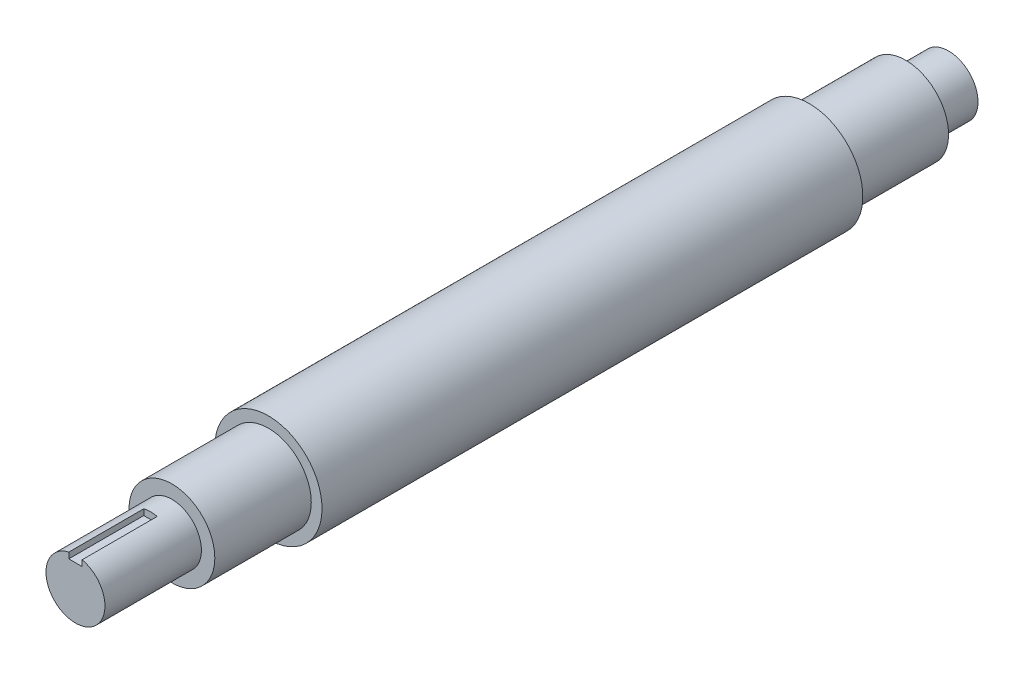
ISO-10303-21;
HEADER;
FILE_DESCRIPTION(('STEP AP214'),'2;1');
FILE_NAME('part.step','',(''),(''),'','','');
FILE_SCHEMA(('AUTOMOTIVE_DESIGN { 1 0 10303 214 1 1 1 1 }'));
ENDSEC;
DATA;
#1=APPLICATION_CONTEXT('core data for automotive mechanical design processes');
#2=APPLICATION_PROTOCOL_DEFINITION('international standard','automotive_design',2000,#1);
#3=PRODUCT_CONTEXT('',#1,'mechanical');
#4=PRODUCT('Part','Part','',(#3));
#5=PRODUCT_RELATED_PRODUCT_CATEGORY('part','',(#4));
#6=PRODUCT_DEFINITION_FORMATION('','',#4);
#7=PRODUCT_DEFINITION_CONTEXT('part definition',#1,'design');
#8=PRODUCT_DEFINITION('design','',#6,#7);
#9=PRODUCT_DEFINITION_SHAPE('','',#8);
#10=(LENGTH_UNIT() NAMED_UNIT(*) SI_UNIT(.MILLI.,.METRE.));
#11=(NAMED_UNIT(*) PLANE_ANGLE_UNIT() SI_UNIT($,.RADIAN.));
#12=(NAMED_UNIT(*) SI_UNIT($,.STERADIAN.) SOLID_ANGLE_UNIT());
#13=UNCERTAINTY_MEASURE_WITH_UNIT(LENGTH_MEASURE(1.E-05),#10,'distance_accuracy_value','');
#14=(GEOMETRIC_REPRESENTATION_CONTEXT(3) GLOBAL_UNCERTAINTY_ASSIGNED_CONTEXT((#13)) GLOBAL_UNIT_ASSIGNED_CONTEXT((#10,
#11,#12)) REPRESENTATION_CONTEXT('',''));
#15=CARTESIAN_POINT('',(0.,0.,0.));
#16=DIRECTION('',(0.,0.,1.));
#17=DIRECTION('',(1.,0.,0.));
#18=AXIS2_PLACEMENT_3D('',#15,#16,#17);
#19=CARTESIAN_POINT('',(0.,0.,160.1978));
#20=DIRECTION('',(0.,0.,-1.));
#21=DIRECTION('',(-1.,0.,0.));
#22=AXIS2_PLACEMENT_3D('',#19,#20,#21);
#23=CYLINDRICAL_SURFACE('',#22,31.75);
#24=CARTESIAN_POINT('',(0.,0.,160.1978));
#25=DIRECTION('',(0.,0.,1.));
#26=DIRECTION('',(1.,0.,0.));
#27=AXIS2_PLACEMENT_3D('',#24,#25,#26);
#28=CIRCLE('',#27,31.75);
#29=CARTESIAN_POINT('',(-31.75,0.,160.1978));
#30=VERTEX_POINT('',#29);
#31=EDGE_CURVE('E124',#30,#30,#28,.T.);
#32=CARTESIAN_POINT('',(0.,0.,-160.1978));
#33=DIRECTION('',(0.,0.,1.));
#34=DIRECTION('',(1.,0.,0.));
#35=AXIS2_PLACEMENT_3D('',#32,#33,#34);
#36=CIRCLE('',#35,31.75);
#37=CARTESIAN_POINT('',(-31.75,0.,-160.1978));
#38=VERTEX_POINT('',#37);
#39=EDGE_CURVE('E121',#38,#38,#36,.T.);
#40=CARTESIAN_POINT('',(-31.75,0.,160.1978));
#41=CARTESIAN_POINT('',(-31.75,0.,156.860345833333));
#42=CARTESIAN_POINT('',(-31.75,0.,153.522891666667));
#43=CARTESIAN_POINT('',(-31.75,0.,146.847983333333));
#44=CARTESIAN_POINT('',(-31.75,0.,143.510529166667));
#45=CARTESIAN_POINT('',(-31.75,0.,136.835620833333));
#46=CARTESIAN_POINT('',(-31.75,0.,133.498166666667));
#47=CARTESIAN_POINT('',(-31.75,0.,126.823258333333));
#48=CARTESIAN_POINT('',(-31.75,0.,123.485804166667));
#49=CARTESIAN_POINT('',(-31.75,0.,116.810895833333));
#50=CARTESIAN_POINT('',(-31.75,0.,113.473441666667));
#51=CARTESIAN_POINT('',(-31.75,0.,106.798533333333));
#52=CARTESIAN_POINT('',(-31.75,0.,103.461079166667));
#53=CARTESIAN_POINT('',(-31.75,0.,96.7861708333333));
#54=CARTESIAN_POINT('',(-31.75,0.,93.4487166666666));
#55=CARTESIAN_POINT('',(-31.75,0.,86.7738083333333));
#56=CARTESIAN_POINT('',(-31.75,0.,83.4363541666666));
#57=CARTESIAN_POINT('',(-31.75,0.,76.7614458333333));
#58=CARTESIAN_POINT('',(-31.75,0.,73.4239916666666));
#59=CARTESIAN_POINT('',(-31.75,0.,66.7490833333333));
#60=CARTESIAN_POINT('',(-31.75,0.,63.4116291666666));
#61=CARTESIAN_POINT('',(-31.75,0.,56.7367208333333));
#62=CARTESIAN_POINT('',(-31.75,0.,53.3992666666666));
#63=CARTESIAN_POINT('',(-31.75,0.,46.7243583333333));
#64=CARTESIAN_POINT('',(-31.75,0.,43.3869041666666));
#65=CARTESIAN_POINT('',(-31.75,0.,36.7119958333333));
#66=CARTESIAN_POINT('',(-31.75,0.,33.3745416666666));
#67=CARTESIAN_POINT('',(-31.75,0.,26.6996333333333));
#68=CARTESIAN_POINT('',(-31.75,0.,23.3621791666667));
#69=CARTESIAN_POINT('',(-31.75,0.,16.6872708333333));
#70=CARTESIAN_POINT('',(-31.75,0.,13.3498166666667));
#71=CARTESIAN_POINT('',(-31.75,0.,6.67490833333331));
#72=CARTESIAN_POINT('',(-31.75,0.,3.33745416666664));
#73=CARTESIAN_POINT('',(-31.75,0.,-3.3374541666667));
#74=CARTESIAN_POINT('',(-31.75,0.,-6.67490833333337));
#75=CARTESIAN_POINT('',(-31.75,0.,-13.3498166666667));
#76=CARTESIAN_POINT('',(-31.75,0.,-16.6872708333334));
#77=CARTESIAN_POINT('',(-31.75,0.,-23.3621791666667));
#78=CARTESIAN_POINT('',(-31.75,0.,-26.6996333333334));
#79=CARTESIAN_POINT('',(-31.75,0.,-33.3745416666667));
#80=CARTESIAN_POINT('',(-31.75,0.,-36.7119958333334));
#81=CARTESIAN_POINT('',(-31.75,0.,-43.3869041666667));
#82=CARTESIAN_POINT('',(-31.75,0.,-46.7243583333334));
#83=CARTESIAN_POINT('',(-31.75,0.,-53.3992666666667));
#84=CARTESIAN_POINT('',(-31.75,0.,-56.7367208333334));
#85=CARTESIAN_POINT('',(-31.75,0.,-63.4116291666667));
#86=CARTESIAN_POINT('',(-31.75,0.,-66.7490833333334));
#87=CARTESIAN_POINT('',(-31.75,0.,-73.4239916666667));
#88=CARTESIAN_POINT('',(-31.75,0.,-76.7614458333334));
#89=CARTESIAN_POINT('',(-31.75,0.,-83.4363541666667));
#90=CARTESIAN_POINT('',(-31.75,0.,-86.7738083333333));
#91=CARTESIAN_POINT('',(-31.75,0.,-93.4487166666667));
#92=CARTESIAN_POINT('',(-31.75,0.,-96.7861708333334));
#93=CARTESIAN_POINT('',(-31.75,0.,-103.461079166667));
#94=CARTESIAN_POINT('',(-31.75,0.,-106.798533333333));
#95=CARTESIAN_POINT('',(-31.75,0.,-113.473441666667));
#96=CARTESIAN_POINT('',(-31.75,0.,-116.810895833333));
#97=CARTESIAN_POINT('',(-31.75,0.,-123.485804166667));
#98=CARTESIAN_POINT('',(-31.75,0.,-126.823258333333));
#99=CARTESIAN_POINT('',(-31.75,0.,-133.498166666667));
#100=CARTESIAN_POINT('',(-31.75,0.,-136.835620833333));
#101=CARTESIAN_POINT('',(-31.75,0.,-143.510529166667));
#102=CARTESIAN_POINT('',(-31.75,0.,-146.847983333333));
#103=CARTESIAN_POINT('',(-31.75,0.,-153.522891666667));
#104=CARTESIAN_POINT('',(-31.75,0.,-156.860345833333));
#105=CARTESIAN_POINT('',(-31.75,0.,-160.1978));
#106=B_SPLINE_CURVE_WITH_KNOTS('',3,(#40,#41,#42,#43,#44,#45,#46,#47,#48,#49,#50,#51,#52,#53,
#54,#55,#56,#57,#58,#59,#60,#61,#62,#63,#64,#65,#66,#67,#68,#69,#70,#71,#72,#73,#74,#75,#76,#77,
#78,#79,#80,#81,#82,#83,#84,#85,#86,#87,#88,#89,#90,#91,#92,#93,#94,#95,#96,#97,#98,#99,#100,
#101,#102,#103,#104,#105),.UNSPECIFIED.,.F.,.F.,(4,2,2,2,2,2,2,2,2,2,2,2,2,2,2,2,2,2,2,2,2,2,2,
2,2,2,2,2,2,2,2,2,4),(0.,10.0123625,20.024725,30.0370875,40.04945,50.0618125,60.074175,
70.0865375,80.0989,90.1112625,100.123625,110.1359875,120.14835,130.1607125,140.173075,
150.1854375,160.1978,170.2101625,180.222525,190.2348875,200.24725,210.2596125,220.271975,
230.2843375,240.2967,250.3090625,260.321425,270.3337875,280.34615,290.3585125,300.370875,
310.3832375,320.3956),.UNSPECIFIED.);
#107=EDGE_CURVE('BSEAM32',#30,#38,#106,.T.);
#108=ORIENTED_EDGE('',*,*,#31,.F.);
#109=ORIENTED_EDGE('',*,*,#39,.T.);
#110=ORIENTED_EDGE('',*,*,#107,.T.);
#111=ORIENTED_EDGE('',*,*,#107,.F.);
#112=EDGE_LOOP('',(#108,#110,#109,#111));
#113=FACE_BOUND('',#112,.T.);
#114=ADVANCED_FACE('F32',(#113),#23,.T.);
#115=CARTESIAN_POINT('',(0.,0.,160.1978));
#116=DIRECTION('',(0.,0.,1.));
#117=DIRECTION('',(1.,0.,0.));
#118=AXIS2_PLACEMENT_3D('',#115,#116,#117);
#119=PLANE('',#118);
#120=CARTESIAN_POINT('',(0.,0.,160.1978));
#121=DIRECTION('',(0.,0.,1.));
#122=DIRECTION('',(1.,0.,0.));
#123=AXIS2_PLACEMENT_3D('',#120,#121,#122);
#124=CIRCLE('',#123,25.4);
#125=CARTESIAN_POINT('',(25.4,0.,160.1978));
#126=VERTEX_POINT('',#125);
#127=EDGE_CURVE('E118',#126,#126,#124,.T.);
#128=ORIENTED_EDGE('',*,*,#127,.F.);
#129=EDGE_LOOP('',(#128));
#130=FACE_BOUND('',#129,.T.);
#131=ORIENTED_EDGE('',*,*,#31,.T.);
#132=EDGE_LOOP('',(#131));
#133=FACE_BOUND('',#132,.T.);
#134=ADVANCED_FACE('F134',(#130,#133),#119,.T.);
#135=CARTESIAN_POINT('',(0.,0.,-160.1978));
#136=DIRECTION('',(0.,0.,1.));
#137=DIRECTION('',(1.,0.,0.));
#138=AXIS2_PLACEMENT_3D('',#135,#136,#137);
#139=PLANE('',#138);
#140=CARTESIAN_POINT('',(0.,0.,-160.1978));
#141=DIRECTION('',(0.,0.,-1.));
#142=DIRECTION('',(-1.,0.,0.));
#143=AXIS2_PLACEMENT_3D('',#140,#141,#142);
#144=CIRCLE('',#143,25.4);
#145=CARTESIAN_POINT('',(-25.4,0.,-160.1978));
#146=VERTEX_POINT('',#145);
#147=EDGE_CURVE('E112',#146,#146,#144,.T.);
#148=ORIENTED_EDGE('',*,*,#147,.F.);
#149=EDGE_LOOP('',(#148));
#150=FACE_BOUND('',#149,.T.);
#151=ORIENTED_EDGE('',*,*,#39,.F.);
#152=EDGE_LOOP('',(#151));
#153=FACE_BOUND('',#152,.T.);
#154=ADVANCED_FACE('F131',(#150,#153),#139,.F.);
#155=CARTESIAN_POINT('',(0.,0.,217.3478));
#156=DIRECTION('',(0.,0.,-1.));
#157=DIRECTION('',(-1.,0.,0.));
#158=AXIS2_PLACEMENT_3D('',#155,#156,#157);
#159=CYLINDRICAL_SURFACE('',#158,25.4);
#160=CARTESIAN_POINT('',(0.,0.,217.3478));
#161=DIRECTION('',(0.,0.,1.));
#162=DIRECTION('',(1.,0.,0.));
#163=AXIS2_PLACEMENT_3D('',#160,#161,#162);
#164=CIRCLE('',#163,25.4);
#165=CARTESIAN_POINT('',(25.4,0.,217.3478));
#166=VERTEX_POINT('',#165);
#167=EDGE_CURVE('E115',#166,#166,#164,.T.);
#168=ORIENTED_EDGE('',*,*,#167,.F.);
#169=EDGE_LOOP('',(#168));
#170=FACE_BOUND('',#169,.T.);
#171=ORIENTED_EDGE('',*,*,#127,.T.);
#172=EDGE_LOOP('',(#171));
#173=FACE_BOUND('',#172,.T.);
#174=ADVANCED_FACE('F133',(#170,#173),#159,.T.);
#175=CARTESIAN_POINT('',(0.,0.,217.3478));
#176=DIRECTION('',(0.,0.,1.));
#177=DIRECTION('',(1.,0.,0.));
#178=AXIS2_PLACEMENT_3D('',#175,#176,#177);
#179=PLANE('',#178);
#180=CARTESIAN_POINT('',(0.,0.,217.3478));
#181=DIRECTION('',(0.,0.,1.));
#182=DIRECTION('',(1.,0.,0.));
#183=AXIS2_PLACEMENT_3D('',#180,#181,#182);
#184=CIRCLE('',#183,17.4625);
#185=CARTESIAN_POINT('',(17.4625,0.,217.3478));
#186=VERTEX_POINT('',#185);
#187=EDGE_CURVE('E103',#186,#186,#184,.T.);
#188=ORIENTED_EDGE('',*,*,#187,.F.);
#189=EDGE_LOOP('',(#188));
#190=FACE_BOUND('',#189,.T.);
#191=ORIENTED_EDGE('',*,*,#167,.T.);
#192=EDGE_LOOP('',(#191));
#193=FACE_BOUND('',#192,.T.);
#194=ADVANCED_FACE('F140',(#190,#193),#179,.T.);
#195=CARTESIAN_POINT('',(0.,0.,-217.3478));
#196=DIRECTION('',(0.,0.,1.));
#197=DIRECTION('',(1.,0.,0.));
#198=AXIS2_PLACEMENT_3D('',#195,#196,#197);
#199=CYLINDRICAL_SURFACE('',#198,25.4);
#200=CARTESIAN_POINT('',(0.,0.,-217.3478));
#201=DIRECTION('',(0.,0.,-1.));
#202=DIRECTION('',(-1.,0.,0.));
#203=AXIS2_PLACEMENT_3D('',#200,#201,#202);
#204=CIRCLE('',#203,25.4);
#205=CARTESIAN_POINT('',(-25.4,0.,-217.3478));
#206=VERTEX_POINT('',#205);
#207=EDGE_CURVE('E109',#206,#206,#204,.T.);
#208=ORIENTED_EDGE('',*,*,#207,.F.);
#209=EDGE_LOOP('',(#208));
#210=FACE_BOUND('',#209,.T.);
#211=ORIENTED_EDGE('',*,*,#147,.T.);
#212=EDGE_LOOP('',(#211));
#213=FACE_BOUND('',#212,.T.);
#214=ADVANCED_FACE('F173',(#210,#213),#199,.T.);
#215=CARTESIAN_POINT('',(0.,0.,-217.3478));
#216=DIRECTION('',(0.,0.,-1.));
#217=DIRECTION('',(-1.,0.,0.));
#218=AXIS2_PLACEMENT_3D('',#215,#216,#217);
#219=PLANE('',#218);
#220=CARTESIAN_POINT('',(0.,0.,-217.3478));
#221=DIRECTION('',(0.,0.,-1.));
#222=DIRECTION('',(-1.,0.,0.));
#223=AXIS2_PLACEMENT_3D('',#220,#221,#222);
#224=CIRCLE('',#223,17.4625);
#225=CARTESIAN_POINT('',(-17.4625,0.,-217.3478));
#226=VERTEX_POINT('',#225);
#227=EDGE_CURVE('E106',#226,#226,#224,.T.);
#228=ORIENTED_EDGE('',*,*,#227,.F.);
#229=EDGE_LOOP('',(#228));
#230=FACE_BOUND('',#229,.T.);
#231=ORIENTED_EDGE('',*,*,#207,.T.);
#232=EDGE_LOOP('',(#231));
#233=FACE_BOUND('',#232,.T.);
#234=ADVANCED_FACE('F178',(#230,#233),#219,.T.);
#235=CARTESIAN_POINT('',(0.,0.,-242.7478));
#236=DIRECTION('',(0.,0.,1.));
#237=DIRECTION('',(1.,0.,0.));
#238=AXIS2_PLACEMENT_3D('',#235,#236,#237);
#239=CYLINDRICAL_SURFACE('',#238,17.4625);
#240=CARTESIAN_POINT('',(0.,0.,-242.7478));
#241=DIRECTION('',(0.,0.,-1.));
#242=DIRECTION('',(-1.,0.,0.));
#243=AXIS2_PLACEMENT_3D('',#240,#241,#242);
#244=CIRCLE('',#243,17.4625);
#245=CARTESIAN_POINT('',(-17.4625,0.,-242.7478));
#246=VERTEX_POINT('',#245);
#247=EDGE_CURVE('E102',#246,#246,#244,.T.);
#248=ORIENTED_EDGE('',*,*,#247,.F.);
#249=EDGE_LOOP('',(#248));
#250=FACE_BOUND('',#249,.T.);
#251=ORIENTED_EDGE('',*,*,#227,.T.);
#252=EDGE_LOOP('',(#251));
#253=FACE_BOUND('',#252,.T.);
#254=ADVANCED_FACE('F188',(#250,#253),#239,.T.);
#255=CARTESIAN_POINT('',(0.,0.,-242.7478));
#256=DIRECTION('',(0.,0.,-1.));
#257=DIRECTION('',(-1.,0.,0.));
#258=AXIS2_PLACEMENT_3D('',#255,#256,#257);
#259=PLANE('',#258);
#260=ORIENTED_EDGE('',*,*,#247,.T.);
#261=EDGE_LOOP('',(#260));
#262=FACE_BOUND('',#261,.T.);
#263=ADVANCED_FACE('F198',(#262),#259,.T.);
#264=CARTESIAN_POINT('',(0.,0.,274.4978));
#265=DIRECTION('',(0.,0.,-1.));
#266=DIRECTION('',(-1.,0.,0.));
#267=AXIS2_PLACEMENT_3D('',#264,#265,#266);
#268=CYLINDRICAL_SURFACE('',#267,17.4625);
#269=CARTESIAN_POINT('',(0.,0.,230.0478));
#270=DIRECTION('',(0.,0.,-1.));
#271=DIRECTION('',(-1.,0.,0.));
#272=AXIS2_PLACEMENT_3D('',#269,#270,#271);
#273=CIRCLE('',#272,17.4625);
#274=CARTESIAN_POINT('',(-3.9624,17.0070071585215,230.0478));
#275=VERTEX_POINT('',#274);
#276=CARTESIAN_POINT('',(3.9624,17.0070071585214,230.0478));
#277=VERTEX_POINT('',#276);
#278=EDGE_CURVE('E11',#275,#277,#273,.T.);
#279=ORIENTED_EDGE('',*,*,#278,.T.);
#280=DIRECTION('',(0.,0.,-1.));
#281=VECTOR('',#280,1.);
#282=CARTESIAN_POINT('',(3.9624,17.0070071585214,274.4978));
#283=LINE('',#282,#281);
#284=CARTESIAN_POINT('',(3.9624,17.0070071585214,274.4978));
#285=VERTEX_POINT('',#284);
#286=EDGE_CURVE('E54',#277,#285,#283,.F.);
#287=ORIENTED_EDGE('',*,*,#286,.T.);
#288=CARTESIAN_POINT('',(0.,0.,274.4978));
#289=DIRECTION('',(0.,0.,1.));
#290=DIRECTION('',(1.,0.,0.));
#291=AXIS2_PLACEMENT_3D('',#288,#289,#290);
#292=CIRCLE('',#291,17.4625);
#293=CARTESIAN_POINT('',(-3.9624,17.0070071585215,274.4978));
#294=VERTEX_POINT('',#293);
#295=EDGE_CURVE('E99',#294,#285,#292,.T.);
#296=ORIENTED_EDGE('',*,*,#295,.F.);
#297=DIRECTION('',(0.,0.,-1.));
#298=VECTOR('',#297,1.);
#299=CARTESIAN_POINT('',(-3.9624,17.0070071585215,274.4978));
#300=LINE('',#299,#298);
#301=EDGE_CURVE('E46',#294,#275,#300,.T.);
#302=ORIENTED_EDGE('',*,*,#301,.T.);
#303=EDGE_LOOP('',(#279,#287,#296,#302));
#304=FACE_BOUND('',#303,.T.);
#305=ORIENTED_EDGE('',*,*,#187,.T.);
#306=EDGE_LOOP('',(#305));
#307=FACE_BOUND('',#306,.T.);
#308=ADVANCED_FACE('F208',(#304,#307),#268,.T.);
#309=CARTESIAN_POINT('',(0.,0.,274.4978));
#310=DIRECTION('',(0.,0.,1.));
#311=DIRECTION('',(1.,0.,0.));
#312=AXIS2_PLACEMENT_3D('',#309,#310,#311);
#313=PLANE('',#312);
#314=DIRECTION('',(0.,1.,0.));
#315=VECTOR('',#314,1.);
#316=CARTESIAN_POINT('',(3.9624,13.5001,274.4978));
#317=LINE('',#316,#315);
#318=CARTESIAN_POINT('',(3.9624,13.5001,274.4978));
#319=VERTEX_POINT('',#318);
#320=EDGE_CURVE('E92',#319,#285,#317,.T.);
#321=ORIENTED_EDGE('',*,*,#320,.F.);
#322=DIRECTION('',(1.,0.,0.));
#323=VECTOR('',#322,1.);
#324=CARTESIAN_POINT('',(-3.9624,13.5001,274.4978));
#325=LINE('',#324,#323);
#326=CARTESIAN_POINT('',(-3.9624,13.5001,274.4978));
#327=VERTEX_POINT('',#326);
#328=EDGE_CURVE('E94',#327,#319,#325,.T.);
#329=ORIENTED_EDGE('',*,*,#328,.F.);
#330=DIRECTION('',(0.,-1.,0.));
#331=VECTOR('',#330,1.);
#332=CARTESIAN_POINT('',(-3.9624,0.,274.4978));
#333=LINE('',#332,#331);
#334=EDGE_CURVE('E39',#294,#327,#333,.T.);
#335=ORIENTED_EDGE('',*,*,#334,.F.);
#336=ORIENTED_EDGE('',*,*,#295,.T.);
#337=EDGE_LOOP('',(#321,#329,#335,#336));
#338=FACE_BOUND('',#337,.T.);
#339=ADVANCED_FACE('F225',(#338),#313,.T.);
#340=CARTESIAN_POINT('',(0.,0.,230.0478));
#341=DIRECTION('',(0.,0.,-1.));
#342=DIRECTION('',(-1.,0.,0.));
#343=AXIS2_PLACEMENT_3D('',#340,#341,#342);
#344=PLANE('',#343);
#345=DIRECTION('',(0.,-1.,0.));
#346=VECTOR('',#345,1.);
#347=CARTESIAN_POINT('',(-3.9624,13.5001,230.0478));
#348=LINE('',#347,#346);
#349=CARTESIAN_POINT('',(-3.9624,13.5001,230.0478));
#350=VERTEX_POINT('',#349);
#351=EDGE_CURVE('E73',#275,#350,#348,.T.);
#352=ORIENTED_EDGE('',*,*,#351,.T.);
#353=DIRECTION('',(1.,0.,0.));
#354=VECTOR('',#353,1.);
#355=CARTESIAN_POINT('',(-3.9624,13.5001,230.0478));
#356=LINE('',#355,#354);
#357=CARTESIAN_POINT('',(3.9624,13.5001,230.0478));
#358=VERTEX_POINT('',#357);
#359=EDGE_CURVE('E77',#350,#358,#356,.T.);
#360=ORIENTED_EDGE('',*,*,#359,.T.);
#361=DIRECTION('',(0.,1.,0.));
#362=VECTOR('',#361,1.);
#363=CARTESIAN_POINT('',(3.9624,13.5001,230.0478));
#364=LINE('',#363,#362);
#365=EDGE_CURVE('E78',#358,#277,#364,.T.);
#366=ORIENTED_EDGE('',*,*,#365,.T.);
#367=ORIENTED_EDGE('',*,*,#278,.F.);
#368=EDGE_LOOP('',(#352,#360,#366,#367));
#369=FACE_BOUND('',#368,.T.);
#370=ADVANCED_FACE('F75',(#369),#344,.F.);
#371=CARTESIAN_POINT('',(3.9624,13.5001,230.0478));
#372=DIRECTION('',(1.,0.,0.));
#373=DIRECTION('',(0.,0.,-1.));
#374=AXIS2_PLACEMENT_3D('',#371,#372,#373);
#375=PLANE('',#374);
#376=ORIENTED_EDGE('',*,*,#365,.F.);
#377=DIRECTION('',(0.,0.,1.));
#378=VECTOR('',#377,1.);
#379=CARTESIAN_POINT('',(3.9624,13.5001,230.0478));
#380=LINE('',#379,#378);
#381=EDGE_CURVE('E86',#358,#319,#380,.T.);
#382=ORIENTED_EDGE('',*,*,#381,.T.);
#383=ORIENTED_EDGE('',*,*,#320,.T.);
#384=ORIENTED_EDGE('',*,*,#286,.F.);
#385=EDGE_LOOP('',(#376,#382,#383,#384));
#386=FACE_BOUND('',#385,.T.);
#387=ADVANCED_FACE('F244',(#386),#375,.F.);
#388=CARTESIAN_POINT('',(-3.9624,13.5001,230.0478));
#389=DIRECTION('',(-1.,0.,0.));
#390=DIRECTION('',(0.,0.,1.));
#391=AXIS2_PLACEMENT_3D('',#388,#389,#390);
#392=PLANE('',#391);
#393=ORIENTED_EDGE('',*,*,#334,.T.);
#394=DIRECTION('',(0.,0.,1.));
#395=VECTOR('',#394,1.);
#396=CARTESIAN_POINT('',(-3.9624,13.5001,230.0478));
#397=LINE('',#396,#395);
#398=EDGE_CURVE('E81',#350,#327,#397,.T.);
#399=ORIENTED_EDGE('',*,*,#398,.F.);
#400=ORIENTED_EDGE('',*,*,#351,.F.);
#401=ORIENTED_EDGE('',*,*,#301,.F.);
#402=EDGE_LOOP('',(#393,#399,#400,#401));
#403=FACE_BOUND('',#402,.T.);
#404=ADVANCED_FACE('F82',(#403),#392,.F.);
#405=CARTESIAN_POINT('',(-3.9624,13.5001,230.0478));
#406=DIRECTION('',(0.,-1.,0.));
#407=DIRECTION('',(0.,0.,-1.));
#408=AXIS2_PLACEMENT_3D('',#405,#406,#407);
#409=PLANE('',#408);
#410=ORIENTED_EDGE('',*,*,#328,.T.);
#411=ORIENTED_EDGE('',*,*,#381,.F.);
#412=ORIENTED_EDGE('',*,*,#359,.F.);
#413=ORIENTED_EDGE('',*,*,#398,.T.);
#414=EDGE_LOOP('',(#410,#411,#412,#413));
#415=FACE_BOUND('',#414,.T.);
#416=ADVANCED_FACE('F88',(#415),#409,.F.);
#417=CLOSED_SHELL('',(#114,#134,#154,#174,#194,#214,#234,#254,#263,#308,#339,#370,#387,#404,#416));
#418=MANIFOLD_SOLID_BREP('B2',#417);
#419=ADVANCED_BREP_SHAPE_REPRESENTATION('',(#18,#418),#14);
#420=SHAPE_DEFINITION_REPRESENTATION(#9,#419);
ENDSEC;
END-ISO-10303-21;
